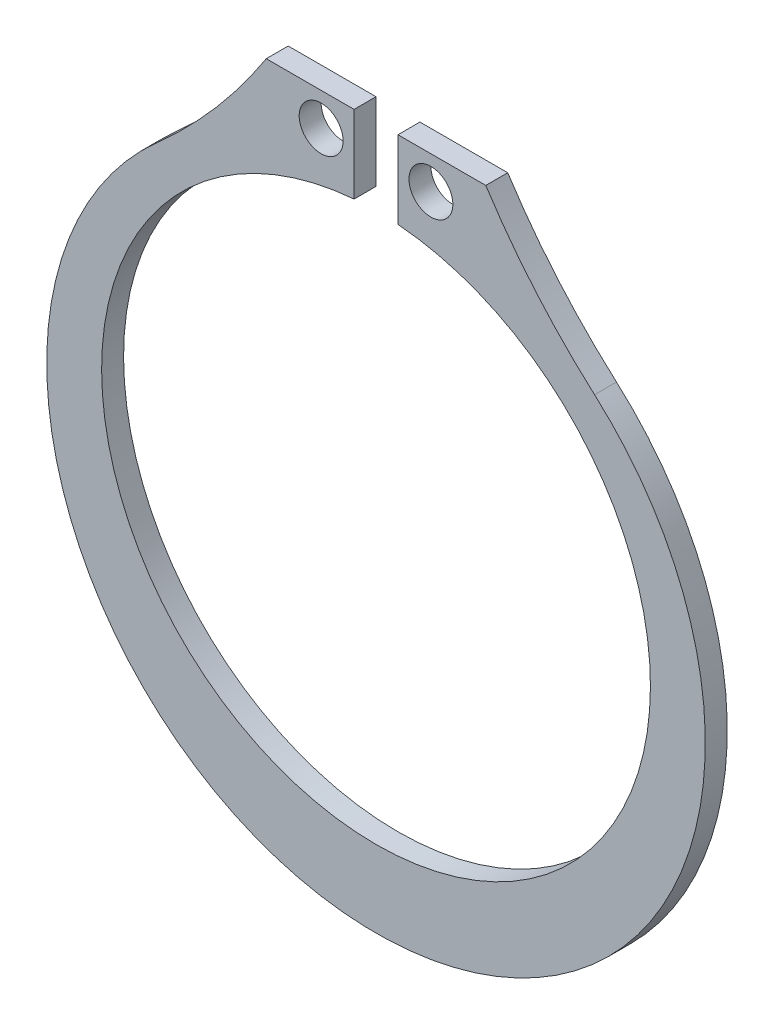
ISO-10303-21;
HEADER;
FILE_DESCRIPTION(('STEP AP214'),'2;1');
FILE_NAME('part.step','',(''),(''),'','','');
FILE_SCHEMA(('AUTOMOTIVE_DESIGN { 1 0 10303 214 1 1 1 1 }'));
ENDSEC;
DATA;
#1=APPLICATION_CONTEXT('core data for automotive mechanical design processes');
#2=APPLICATION_PROTOCOL_DEFINITION('international standard','automotive_design',2000,#1);
#3=PRODUCT_CONTEXT('',#1,'mechanical');
#4=PRODUCT('Part','Part','',(#3));
#5=PRODUCT_RELATED_PRODUCT_CATEGORY('part','',(#4));
#6=PRODUCT_DEFINITION_FORMATION('','',#4);
#7=PRODUCT_DEFINITION_CONTEXT('part definition',#1,'design');
#8=PRODUCT_DEFINITION('design','',#6,#7);
#9=PRODUCT_DEFINITION_SHAPE('','',#8);
#10=(LENGTH_UNIT() NAMED_UNIT(*) SI_UNIT(.MILLI.,.METRE.));
#11=(NAMED_UNIT(*) PLANE_ANGLE_UNIT() SI_UNIT($,.RADIAN.));
#12=(NAMED_UNIT(*) SI_UNIT($,.STERADIAN.) SOLID_ANGLE_UNIT());
#13=UNCERTAINTY_MEASURE_WITH_UNIT(LENGTH_MEASURE(1.E-05),#10,'distance_accuracy_value','');
#14=(GEOMETRIC_REPRESENTATION_CONTEXT(3) GLOBAL_UNCERTAINTY_ASSIGNED_CONTEXT((#13)) GLOBAL_UNIT_ASSIGNED_CONTEXT((#10,
#11,#12)) REPRESENTATION_CONTEXT('',''));
#15=CARTESIAN_POINT('',(0.,0.,0.));
#16=DIRECTION('',(0.,0.,1.));
#17=DIRECTION('',(1.,0.,0.));
#18=AXIS2_PLACEMENT_3D('',#15,#16,#17);
#19=CARTESIAN_POINT('',(-28.5373817339157,32.165475960613,1.));
#20=DIRECTION('',(0.,0.,-1.));
#21=DIRECTION('',(-1.,0.,0.));
#22=AXIS2_PLACEMENT_3D('',#19,#20,#21);
#23=PLANE('',#22);
#24=CARTESIAN_POINT('',(-28.5373817339157,32.165475960613,1.));
#25=DIRECTION('',(0.,0.,-1.));
#26=DIRECTION('',(-1.,0.,0.));
#27=AXIS2_PLACEMENT_3D('',#24,#25,#26);
#28=CIRCLE('',#27,28.);
#29=CARTESIAN_POINT('',(-5.,17.,1.));
#30=VERTEX_POINT('',#29);
#31=CARTESIAN_POINT('',(-9.95490060485431,11.2205148699813,1.));
#32=VERTEX_POINT('',#31);
#33=EDGE_CURVE('E151',#30,#32,#28,.T.);
#34=ORIENTED_EDGE('',*,*,#33,.T.);
#35=CARTESIAN_POINT('',(0.,0.,1.));
#36=DIRECTION('',(0.,0.,1.));
#37=DIRECTION('',(1.,0.,0.));
#38=AXIS2_PLACEMENT_3D('',#35,#36,#37);
#39=CIRCLE('',#38,15.);
#40=CARTESIAN_POINT('',(9.95490060485431,11.2205148699813,1.));
#41=VERTEX_POINT('',#40);
#42=EDGE_CURVE('E99',#32,#41,#39,.T.);
#43=ORIENTED_EDGE('',*,*,#42,.T.);
#44=CARTESIAN_POINT('',(28.5373817339157,32.165475960613,1.));
#45=DIRECTION('',(0.,0.,-1.));
#46=DIRECTION('',(1.,0.,0.));
#47=AXIS2_PLACEMENT_3D('',#44,#45,#46);
#48=CIRCLE('',#47,28.);
#49=CARTESIAN_POINT('',(5.,17.,1.));
#50=VERTEX_POINT('',#49);
#51=EDGE_CURVE('E166',#41,#50,#48,.T.);
#52=ORIENTED_EDGE('',*,*,#51,.T.);
#53=DIRECTION('',(-1.,0.,0.));
#54=VECTOR('',#53,1.);
#55=CARTESIAN_POINT('',(5.,17.,1.));
#56=LINE('',#55,#54);
#57=CARTESIAN_POINT('',(1.,17.,1.));
#58=VERTEX_POINT('',#57);
#59=EDGE_CURVE('E179',#50,#58,#56,.T.);
#60=ORIENTED_EDGE('',*,*,#59,.T.);
#61=DIRECTION('',(0.,-1.,0.));
#62=VECTOR('',#61,1.);
#63=CARTESIAN_POINT('',(1.,17.,1.));
#64=LINE('',#63,#62);
#65=CARTESIAN_POINT('',(0.999999999999999,13.4599357943771,1.));
#66=VERTEX_POINT('',#65);
#67=EDGE_CURVE('E118',#58,#66,#64,.T.);
#68=ORIENTED_EDGE('',*,*,#67,.T.);
#69=CARTESIAN_POINT('',(0.,1.,1.));
#70=DIRECTION('',(0.,0.,-1.));
#71=DIRECTION('',(1.,0.,0.));
#72=AXIS2_PLACEMENT_3D('',#69,#70,#71);
#73=CIRCLE('',#72,12.5);
#74=CARTESIAN_POINT('',(-1.,13.4599357943771,1.));
#75=VERTEX_POINT('',#74);
#76=EDGE_CURVE('E112',#66,#75,#73,.T.);
#77=ORIENTED_EDGE('',*,*,#76,.T.);
#78=DIRECTION('',(0.,1.,0.));
#79=VECTOR('',#78,1.);
#80=CARTESIAN_POINT('',(-1.,17.,1.));
#81=LINE('',#80,#79);
#82=CARTESIAN_POINT('',(-1.,17.,1.));
#83=VERTEX_POINT('',#82);
#84=EDGE_CURVE('E116',#75,#83,#81,.T.);
#85=ORIENTED_EDGE('',*,*,#84,.T.);
#86=DIRECTION('',(-1.,0.,0.));
#87=VECTOR('',#86,1.);
#88=CARTESIAN_POINT('',(-5.,17.,1.));
#89=LINE('',#88,#87);
#90=EDGE_CURVE('E56',#83,#30,#89,.T.);
#91=ORIENTED_EDGE('',*,*,#90,.T.);
#92=EDGE_LOOP('',(#34,#43,#52,#60,#68,#77,#85,#91));
#93=FACE_BOUND('',#92,.T.);
#94=CARTESIAN_POINT('',(-2.5,15.5,1.));
#95=DIRECTION('',(0.,0.,1.));
#96=DIRECTION('',(1.,0.,0.));
#97=AXIS2_PLACEMENT_3D('',#94,#95,#96);
#98=CIRCLE('',#97,1.);
#99=CARTESIAN_POINT('',(-1.5,15.5,1.));
#100=VERTEX_POINT('',#99);
#101=EDGE_CURVE('E140',#100,#100,#98,.T.);
#102=ORIENTED_EDGE('',*,*,#101,.F.);
#103=EDGE_LOOP('',(#102));
#104=FACE_BOUND('',#103,.T.);
#105=CARTESIAN_POINT('',(2.5,15.5,1.));
#106=DIRECTION('',(0.,0.,1.));
#107=DIRECTION('',(-1.,0.,0.));
#108=AXIS2_PLACEMENT_3D('',#105,#106,#107);
#109=CIRCLE('',#108,1.);
#110=CARTESIAN_POINT('',(1.5,15.5,1.));
#111=VERTEX_POINT('',#110);
#112=EDGE_CURVE('E188',#111,#111,#109,.T.);
#113=ORIENTED_EDGE('',*,*,#112,.F.);
#114=EDGE_LOOP('',(#113));
#115=FACE_BOUND('',#114,.T.);
#116=ADVANCED_FACE('F39',(#93,#104,#115),#23,.F.);
#117=CARTESIAN_POINT('',(-28.5373817339157,32.165475960613,0.));
#118=DIRECTION('',(0.,0.,-1.));
#119=DIRECTION('',(-1.,0.,0.));
#120=AXIS2_PLACEMENT_3D('',#117,#118,#119);
#121=PLANE('',#120);
#122=CARTESIAN_POINT('',(-2.5,15.5,0.));
#123=DIRECTION('',(0.,0.,1.));
#124=DIRECTION('',(1.,0.,0.));
#125=AXIS2_PLACEMENT_3D('',#122,#123,#124);
#126=CIRCLE('',#125,1.);
#127=CARTESIAN_POINT('',(-1.5,15.5,0.));
#128=VERTEX_POINT('',#127);
#129=EDGE_CURVE('E185',#128,#128,#126,.T.);
#130=ORIENTED_EDGE('',*,*,#129,.T.);
#131=EDGE_LOOP('',(#130));
#132=FACE_BOUND('',#131,.T.);
#133=CARTESIAN_POINT('',(-28.5373817339157,32.165475960613,0.));
#134=DIRECTION('',(0.,0.,-1.));
#135=DIRECTION('',(-1.,0.,0.));
#136=AXIS2_PLACEMENT_3D('',#133,#134,#135);
#137=CIRCLE('',#136,28.);
#138=CARTESIAN_POINT('',(-5.,17.,0.));
#139=VERTEX_POINT('',#138);
#140=CARTESIAN_POINT('',(-9.95490060485431,11.2205148699813,0.));
#141=VERTEX_POINT('',#140);
#142=EDGE_CURVE('E136',#139,#141,#137,.T.);
#143=ORIENTED_EDGE('',*,*,#142,.F.);
#144=DIRECTION('',(-1.,0.,0.));
#145=VECTOR('',#144,1.);
#146=CARTESIAN_POINT('',(-5.,17.,0.));
#147=LINE('',#146,#145);
#148=CARTESIAN_POINT('',(-1.,17.,0.));
#149=VERTEX_POINT('',#148);
#150=EDGE_CURVE('E91',#149,#139,#147,.T.);
#151=ORIENTED_EDGE('',*,*,#150,.F.);
#152=DIRECTION('',(0.,1.,0.));
#153=VECTOR('',#152,1.);
#154=CARTESIAN_POINT('',(-1.,17.,0.));
#155=LINE('',#154,#153);
#156=CARTESIAN_POINT('',(-1.,13.4599357943771,0.));
#157=VERTEX_POINT('',#156);
#158=EDGE_CURVE('E85',#157,#149,#155,.T.);
#159=ORIENTED_EDGE('',*,*,#158,.F.);
#160=CARTESIAN_POINT('',(0.,1.,0.));
#161=DIRECTION('',(0.,0.,-1.));
#162=DIRECTION('',(1.,0.,0.));
#163=AXIS2_PLACEMENT_3D('',#160,#161,#162);
#164=CIRCLE('',#163,12.5);
#165=CARTESIAN_POINT('',(0.999999999999999,13.4599357943771,0.));
#166=VERTEX_POINT('',#165);
#167=EDGE_CURVE('E126',#166,#157,#164,.T.);
#168=ORIENTED_EDGE('',*,*,#167,.F.);
#169=DIRECTION('',(0.,-1.,0.));
#170=VECTOR('',#169,1.);
#171=CARTESIAN_POINT('',(1.,17.,0.));
#172=LINE('',#171,#170);
#173=CARTESIAN_POINT('',(1.,17.,0.));
#174=VERTEX_POINT('',#173);
#175=EDGE_CURVE('E146',#174,#166,#172,.T.);
#176=ORIENTED_EDGE('',*,*,#175,.F.);
#177=DIRECTION('',(-1.,0.,0.));
#178=VECTOR('',#177,1.);
#179=CARTESIAN_POINT('',(5.,17.,0.));
#180=LINE('',#179,#178);
#181=CARTESIAN_POINT('',(5.,17.,0.));
#182=VERTEX_POINT('',#181);
#183=EDGE_CURVE('E144',#182,#174,#180,.T.);
#184=ORIENTED_EDGE('',*,*,#183,.F.);
#185=CARTESIAN_POINT('',(28.5373817339157,32.165475960613,0.));
#186=DIRECTION('',(0.,0.,-1.));
#187=DIRECTION('',(1.,0.,0.));
#188=AXIS2_PLACEMENT_3D('',#185,#186,#187);
#189=CIRCLE('',#188,28.);
#190=CARTESIAN_POINT('',(9.95490060485431,11.2205148699813,0.));
#191=VERTEX_POINT('',#190);
#192=EDGE_CURVE('E142',#191,#182,#189,.T.);
#193=ORIENTED_EDGE('',*,*,#192,.F.);
#194=CARTESIAN_POINT('',(0.,0.,0.));
#195=DIRECTION('',(0.,0.,1.));
#196=DIRECTION('',(1.,0.,0.));
#197=AXIS2_PLACEMENT_3D('',#194,#195,#196);
#198=CIRCLE('',#197,15.);
#199=EDGE_CURVE('E139',#141,#191,#198,.T.);
#200=ORIENTED_EDGE('',*,*,#199,.F.);
#201=EDGE_LOOP('',(#143,#151,#159,#168,#176,#184,#193,#200));
#202=FACE_BOUND('',#201,.T.);
#203=CARTESIAN_POINT('',(2.5,15.5,0.));
#204=DIRECTION('',(0.,0.,1.));
#205=DIRECTION('',(-1.,0.,0.));
#206=AXIS2_PLACEMENT_3D('',#203,#204,#205);
#207=CIRCLE('',#206,1.);
#208=CARTESIAN_POINT('',(1.5,15.5,0.));
#209=VERTEX_POINT('',#208);
#210=EDGE_CURVE('E191',#209,#209,#207,.T.);
#211=ORIENTED_EDGE('',*,*,#210,.T.);
#212=EDGE_LOOP('',(#211));
#213=FACE_BOUND('',#212,.T.);
#214=ADVANCED_FACE('F170',(#132,#202,#213),#121,.T.);
#215=CARTESIAN_POINT('',(-28.5373817339157,32.165475960613,1.));
#216=DIRECTION('',(0.,0.,-1.));
#217=DIRECTION('',(-1.,0.,0.));
#218=AXIS2_PLACEMENT_3D('',#215,#216,#217);
#219=CYLINDRICAL_SURFACE('',#218,28.);
#220=ORIENTED_EDGE('',*,*,#142,.T.);
#221=DIRECTION('',(0.,0.,-1.));
#222=VECTOR('',#221,1.);
#223=CARTESIAN_POINT('',(-9.95490060485431,11.2205148699813,1.));
#224=LINE('',#223,#222);
#225=EDGE_CURVE('E11',#32,#141,#224,.T.);
#226=ORIENTED_EDGE('',*,*,#225,.F.);
#227=ORIENTED_EDGE('',*,*,#33,.F.);
#228=DIRECTION('',(0.,0.,-1.));
#229=VECTOR('',#228,1.);
#230=CARTESIAN_POINT('',(-5.,17.,1.));
#231=LINE('',#230,#229);
#232=EDGE_CURVE('E132',#30,#139,#231,.T.);
#233=ORIENTED_EDGE('',*,*,#232,.T.);
#234=EDGE_LOOP('',(#220,#226,#227,#233));
#235=FACE_BOUND('',#234,.T.);
#236=ADVANCED_FACE('F41',(#235),#219,.F.);
#237=CARTESIAN_POINT('',(0.,0.,1.));
#238=DIRECTION('',(0.,0.,-1.));
#239=DIRECTION('',(-1.,0.,0.));
#240=AXIS2_PLACEMENT_3D('',#237,#238,#239);
#241=CYLINDRICAL_SURFACE('',#240,15.);
#242=ORIENTED_EDGE('',*,*,#199,.T.);
#243=DIRECTION('',(0.,0.,-1.));
#244=VECTOR('',#243,1.);
#245=CARTESIAN_POINT('',(9.95490060485431,11.2205148699813,1.));
#246=LINE('',#245,#244);
#247=EDGE_CURVE('E48',#41,#191,#246,.T.);
#248=ORIENTED_EDGE('',*,*,#247,.F.);
#249=ORIENTED_EDGE('',*,*,#42,.F.);
#250=ORIENTED_EDGE('',*,*,#225,.T.);
#251=EDGE_LOOP('',(#242,#248,#249,#250));
#252=FACE_BOUND('',#251,.T.);
#253=ADVANCED_FACE('F223',(#252),#241,.T.);
#254=CARTESIAN_POINT('',(28.5373817339157,32.165475960613,1.));
#255=DIRECTION('',(0.,0.,-1.));
#256=DIRECTION('',(-1.,0.,0.));
#257=AXIS2_PLACEMENT_3D('',#254,#255,#256);
#258=CYLINDRICAL_SURFACE('',#257,28.);
#259=ORIENTED_EDGE('',*,*,#192,.T.);
#260=DIRECTION('',(0.,0.,-1.));
#261=VECTOR('',#260,1.);
#262=CARTESIAN_POINT('',(5.,17.,1.));
#263=LINE('',#262,#261);
#264=EDGE_CURVE('E158',#50,#182,#263,.T.);
#265=ORIENTED_EDGE('',*,*,#264,.F.);
#266=ORIENTED_EDGE('',*,*,#51,.F.);
#267=ORIENTED_EDGE('',*,*,#247,.T.);
#268=EDGE_LOOP('',(#259,#265,#266,#267));
#269=FACE_BOUND('',#268,.T.);
#270=ADVANCED_FACE('F164',(#269),#258,.F.);
#271=CARTESIAN_POINT('',(5.,17.,1.));
#272=DIRECTION('',(0.,-1.,0.));
#273=DIRECTION('',(0.,0.,-1.));
#274=AXIS2_PLACEMENT_3D('',#271,#272,#273);
#275=PLANE('',#274);
#276=ORIENTED_EDGE('',*,*,#183,.T.);
#277=DIRECTION('',(0.,0.,-1.));
#278=VECTOR('',#277,1.);
#279=CARTESIAN_POINT('',(1.,17.,1.));
#280=LINE('',#279,#278);
#281=EDGE_CURVE('E155',#58,#174,#280,.T.);
#282=ORIENTED_EDGE('',*,*,#281,.F.);
#283=ORIENTED_EDGE('',*,*,#59,.F.);
#284=ORIENTED_EDGE('',*,*,#264,.T.);
#285=EDGE_LOOP('',(#276,#282,#283,#284));
#286=FACE_BOUND('',#285,.T.);
#287=ADVANCED_FACE('F175',(#286),#275,.F.);
#288=CARTESIAN_POINT('',(1.,17.,1.));
#289=DIRECTION('',(1.,0.,0.));
#290=DIRECTION('',(0.,1.,0.));
#291=AXIS2_PLACEMENT_3D('',#288,#289,#290);
#292=PLANE('',#291);
#293=ORIENTED_EDGE('',*,*,#175,.T.);
#294=DIRECTION('',(0.,0.,-1.));
#295=VECTOR('',#294,1.);
#296=CARTESIAN_POINT('',(0.999999999999999,13.4599357943771,1.));
#297=LINE('',#296,#295);
#298=EDGE_CURVE('E127',#66,#166,#297,.T.);
#299=ORIENTED_EDGE('',*,*,#298,.F.);
#300=ORIENTED_EDGE('',*,*,#67,.F.);
#301=ORIENTED_EDGE('',*,*,#281,.T.);
#302=EDGE_LOOP('',(#293,#299,#300,#301));
#303=FACE_BOUND('',#302,.T.);
#304=ADVANCED_FACE('F178',(#303),#292,.F.);
#305=CARTESIAN_POINT('',(0.,1.,1.));
#306=DIRECTION('',(0.,0.,-1.));
#307=DIRECTION('',(-1.,0.,0.));
#308=AXIS2_PLACEMENT_3D('',#305,#306,#307);
#309=CYLINDRICAL_SURFACE('',#308,12.5);
#310=ORIENTED_EDGE('',*,*,#167,.T.);
#311=DIRECTION('',(0.,0.,-1.));
#312=VECTOR('',#311,1.);
#313=CARTESIAN_POINT('',(-1.,13.4599357943771,1.));
#314=LINE('',#313,#312);
#315=EDGE_CURVE('E123',#75,#157,#314,.T.);
#316=ORIENTED_EDGE('',*,*,#315,.F.);
#317=ORIENTED_EDGE('',*,*,#76,.F.);
#318=ORIENTED_EDGE('',*,*,#298,.T.);
#319=EDGE_LOOP('',(#310,#316,#317,#318));
#320=FACE_BOUND('',#319,.T.);
#321=ADVANCED_FACE('F124',(#320),#309,.F.);
#322=CARTESIAN_POINT('',(-1.,17.,1.));
#323=DIRECTION('',(-1.,0.,0.));
#324=DIRECTION('',(0.,-1.,0.));
#325=AXIS2_PLACEMENT_3D('',#322,#323,#324);
#326=PLANE('',#325);
#327=ORIENTED_EDGE('',*,*,#158,.T.);
#328=DIRECTION('',(0.,0.,-1.));
#329=VECTOR('',#328,1.);
#330=CARTESIAN_POINT('',(-1.,17.,1.));
#331=LINE('',#330,#329);
#332=EDGE_CURVE('E128',#83,#149,#331,.T.);
#333=ORIENTED_EDGE('',*,*,#332,.F.);
#334=ORIENTED_EDGE('',*,*,#84,.F.);
#335=ORIENTED_EDGE('',*,*,#315,.T.);
#336=EDGE_LOOP('',(#327,#333,#334,#335));
#337=FACE_BOUND('',#336,.T.);
#338=ADVANCED_FACE('F130',(#337),#326,.F.);
#339=CARTESIAN_POINT('',(-5.,17.,1.));
#340=DIRECTION('',(0.,-1.,0.));
#341=DIRECTION('',(0.,0.,-1.));
#342=AXIS2_PLACEMENT_3D('',#339,#340,#341);
#343=PLANE('',#342);
#344=ORIENTED_EDGE('',*,*,#150,.T.);
#345=ORIENTED_EDGE('',*,*,#232,.F.);
#346=ORIENTED_EDGE('',*,*,#90,.F.);
#347=ORIENTED_EDGE('',*,*,#332,.T.);
#348=EDGE_LOOP('',(#344,#345,#346,#347));
#349=FACE_BOUND('',#348,.T.);
#350=ADVANCED_FACE('F211',(#349),#343,.F.);
#351=CARTESIAN_POINT('',(-2.5,15.5,1.));
#352=DIRECTION('',(0.,0.,-1.));
#353=DIRECTION('',(-1.,0.,0.));
#354=AXIS2_PLACEMENT_3D('',#351,#352,#353);
#355=CYLINDRICAL_SURFACE('',#354,1.);
#356=ORIENTED_EDGE('',*,*,#101,.T.);
#357=EDGE_LOOP('',(#356));
#358=FACE_BOUND('',#357,.T.);
#359=ORIENTED_EDGE('',*,*,#129,.F.);
#360=EDGE_LOOP('',(#359));
#361=FACE_BOUND('',#360,.T.);
#362=ADVANCED_FACE('F208',(#358,#361),#355,.F.);
#363=CARTESIAN_POINT('',(2.5,15.5,1.));
#364=DIRECTION('',(0.,0.,-1.));
#365=DIRECTION('',(-1.,0.,0.));
#366=AXIS2_PLACEMENT_3D('',#363,#364,#365);
#367=CYLINDRICAL_SURFACE('',#366,1.);
#368=ORIENTED_EDGE('',*,*,#112,.T.);
#369=EDGE_LOOP('',(#368));
#370=FACE_BOUND('',#369,.T.);
#371=ORIENTED_EDGE('',*,*,#210,.F.);
#372=EDGE_LOOP('',(#371));
#373=FACE_BOUND('',#372,.T.);
#374=ADVANCED_FACE('F197',(#370,#373),#367,.F.);
#375=CLOSED_SHELL('',(#116,#214,#236,#253,#270,#287,#304,#321,#338,#350,#362,#374));
#376=MANIFOLD_SOLID_BREP('B2',#375);
#377=ADVANCED_BREP_SHAPE_REPRESENTATION('',(#18,#376),#14);
#378=SHAPE_DEFINITION_REPRESENTATION(#9,#377);
ENDSEC;
END-ISO-10303-21;
